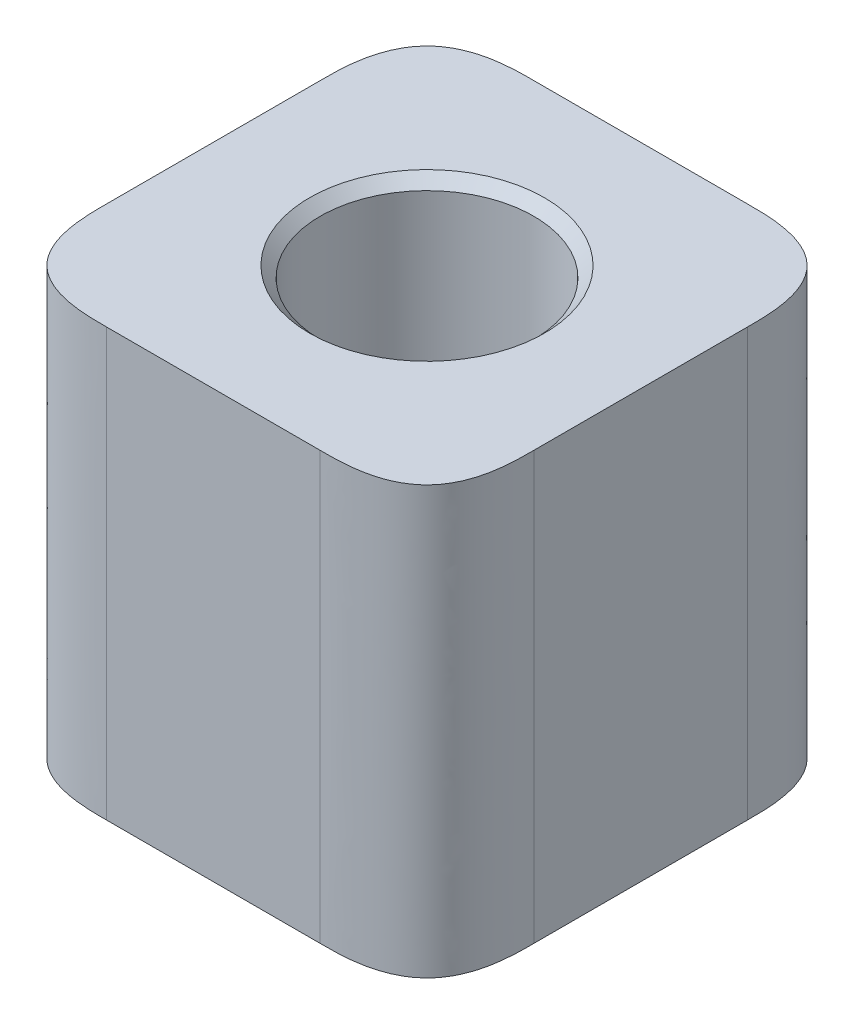
ISO-10303-21;
HEADER;
FILE_DESCRIPTION(('STEP AP214'),'2;1');
FILE_NAME('part.step','',(''),(''),'','','');
FILE_SCHEMA(('AUTOMOTIVE_DESIGN { 1 0 10303 214 1 1 1 1 }'));
ENDSEC;
DATA;
#1=APPLICATION_CONTEXT('core data for automotive mechanical design processes');
#2=APPLICATION_PROTOCOL_DEFINITION('international standard','automotive_design',2000,#1);
#3=PRODUCT_CONTEXT('',#1,'mechanical');
#4=PRODUCT('Part','Part','',(#3));
#5=PRODUCT_RELATED_PRODUCT_CATEGORY('part','',(#4));
#6=PRODUCT_DEFINITION_FORMATION('','',#4);
#7=PRODUCT_DEFINITION_CONTEXT('part definition',#1,'design');
#8=PRODUCT_DEFINITION('design','',#6,#7);
#9=PRODUCT_DEFINITION_SHAPE('','',#8);
#10=(LENGTH_UNIT() NAMED_UNIT(*) SI_UNIT(.MILLI.,.METRE.));
#11=(NAMED_UNIT(*) PLANE_ANGLE_UNIT() SI_UNIT($,.RADIAN.));
#12=(NAMED_UNIT(*) SI_UNIT($,.STERADIAN.) SOLID_ANGLE_UNIT());
#13=UNCERTAINTY_MEASURE_WITH_UNIT(LENGTH_MEASURE(1.E-05),#10,'distance_accuracy_value','');
#14=(GEOMETRIC_REPRESENTATION_CONTEXT(3) GLOBAL_UNCERTAINTY_ASSIGNED_CONTEXT((#13)) GLOBAL_UNIT_ASSIGNED_CONTEXT((#10,
#11,#12)) REPRESENTATION_CONTEXT('',''));
#15=CARTESIAN_POINT('',(0.,0.,0.));
#16=DIRECTION('',(0.,0.,1.));
#17=DIRECTION('',(1.,0.,0.));
#18=AXIS2_PLACEMENT_3D('',#15,#16,#17);
#19=CARTESIAN_POINT('',(0.,7.,0.));
#20=DIRECTION('',(0.,-1.,0.));
#21=DIRECTION('',(0.,0.,-1.));
#22=AXIS2_PLACEMENT_3D('',#19,#20,#21);
#23=CYLINDRICAL_SURFACE('',#22,2.);
#24=CARTESIAN_POINT('',(0.,6.8,0.));
#25=DIRECTION('',(0.,1.,0.));
#26=DIRECTION('',(0.,0.,1.));
#27=AXIS2_PLACEMENT_3D('',#24,#25,#26);
#28=CIRCLE('',#27,2.);
#29=CARTESIAN_POINT('',(0.,6.8,2.));
#30=VERTEX_POINT('',#29);
#31=EDGE_CURVE('E253',#30,#30,#28,.F.);
#32=ORIENTED_EDGE('',*,*,#31,.F.);
#33=EDGE_LOOP('',(#32));
#34=FACE_BOUND('',#33,.T.);
#35=CARTESIAN_POINT('',(0.,0.,0.));
#36=DIRECTION('',(0.,1.,0.));
#37=DIRECTION('',(0.,0.,1.));
#38=AXIS2_PLACEMENT_3D('',#35,#36,#37);
#39=CIRCLE('',#38,2.);
#40=CARTESIAN_POINT('',(0.,0.,2.));
#41=VERTEX_POINT('',#40);
#42=EDGE_CURVE('E273',#41,#41,#39,.T.);
#43=ORIENTED_EDGE('',*,*,#42,.F.);
#44=EDGE_LOOP('',(#43));
#45=FACE_BOUND('',#44,.T.);
#46=ADVANCED_FACE('F39',(#34,#45),#23,.F.);
#47=CARTESIAN_POINT('',(0.,0.,0.));
#48=DIRECTION('',(0.,-1.,0.));
#49=DIRECTION('',(0.,0.,-1.));
#50=AXIS2_PLACEMENT_3D('',#47,#48,#49);
#51=PLANE('',#50);
#52=ORIENTED_EDGE('',*,*,#42,.T.);
#53=EDGE_LOOP('',(#52));
#54=FACE_BOUND('',#53,.T.);
#55=ADVANCED_FACE('F461',(#54),#51,.F.);
#56=CARTESIAN_POINT('',(0.,7.,0.));
#57=DIRECTION('',(0.,1.,0.));
#58=DIRECTION('',(0.,0.,1.));
#59=AXIS2_PLACEMENT_3D('',#56,#57,#58);
#60=CONICAL_SURFACE('',#59,2.2,0.785398163397448);
#61=ORIENTED_EDGE('',*,*,#31,.T.);
#62=EDGE_LOOP('',(#61));
#63=FACE_BOUND('',#62,.T.);
#64=CARTESIAN_POINT('',(0.,7.,0.));
#65=DIRECTION('',(0.,1.,0.));
#66=DIRECTION('',(0.,0.,1.));
#67=AXIS2_PLACEMENT_3D('',#64,#65,#66);
#68=CIRCLE('',#67,2.2);
#69=CARTESIAN_POINT('',(0.,7.,2.2));
#70=VERTEX_POINT('',#69);
#71=EDGE_CURVE('E628',#70,#70,#68,.T.);
#72=ORIENTED_EDGE('',*,*,#71,.T.);
#73=EDGE_LOOP('',(#72));
#74=FACE_BOUND('',#73,.T.);
#75=ADVANCED_FACE('F458',(#63,#74),#60,.F.);
#76=CARTESIAN_POINT('',(0.,-1.,0.));
#77=DIRECTION('',(0.,-1.,0.));
#78=DIRECTION('',(0.,0.,-1.));
#79=AXIS2_PLACEMENT_3D('',#76,#77,#78);
#80=PLANE('',#79);
#81=DIRECTION('',(0.,0.,1.));
#82=VECTOR('',#81,1.);
#83=CARTESIAN_POINT('',(4.,-1.,4.));
#84=LINE('',#83,#82);
#85=CARTESIAN_POINT('',(4.,-1.,-2.));
#86=VERTEX_POINT('',#85);
#87=CARTESIAN_POINT('',(4.,-1.,2.));
#88=VERTEX_POINT('',#87);
#89=EDGE_CURVE('E117',#86,#88,#84,.T.);
#90=ORIENTED_EDGE('',*,*,#89,.T.);
#91=CARTESIAN_POINT('',(2.,-1.00000000000002,4.));
#92=CARTESIAN_POINT('',(2.33639610306789,-1.00000000000002,4.));
#93=CARTESIAN_POINT('',(2.67279220613578,-1.00000000000002,4.));
#94=CARTESIAN_POINT('',(3.4142135623731,-0.999999999999968,3.85661616032783));
#95=CARTESIAN_POINT('',(3.85661616032783,-0.999999999999968,3.4142135623731));
#96=CARTESIAN_POINT('',(4.,-1.00000000000002,2.67279220613578));
#97=CARTESIAN_POINT('',(4.,-1.00000000000002,2.33639610306789));
#98=CARTESIAN_POINT('',(4.,-1.00000000000002,2.));
#99=B_SPLINE_CURVE_WITH_KNOTS('',5,(#91,#92,#93,#94,#95,#96,#97,#98),.UNSPECIFIED.,.F.,.F.,(6,2,
6),(0.,0.5,1.),.UNSPECIFIED.);
#100=CARTESIAN_POINT('',(2.,-1.,4.));
#101=VERTEX_POINT('',#100);
#102=EDGE_CURVE('E238',#88,#101,#99,.F.);
#103=ORIENTED_EDGE('',*,*,#102,.T.);
#104=DIRECTION('',(-1.,0.,0.));
#105=VECTOR('',#104,1.);
#106=CARTESIAN_POINT('',(-4.,-1.,4.));
#107=LINE('',#106,#105);
#108=CARTESIAN_POINT('',(-2.,-1.,4.));
#109=VERTEX_POINT('',#108);
#110=EDGE_CURVE('E138',#101,#109,#107,.T.);
#111=ORIENTED_EDGE('',*,*,#110,.T.);
#112=CARTESIAN_POINT('',(-4.,-1.00000000000002,2.));
#113=CARTESIAN_POINT('',(-4.,-1.00000000000002,2.33639610306789));
#114=CARTESIAN_POINT('',(-4.,-1.00000000000002,2.67279220613578));
#115=CARTESIAN_POINT('',(-3.85661616032783,-0.999999999999968,3.4142135623731));
#116=CARTESIAN_POINT('',(-3.4142135623731,-0.999999999999968,3.85661616032783));
#117=CARTESIAN_POINT('',(-2.67279220613578,-1.00000000000002,4.));
#118=CARTESIAN_POINT('',(-2.33639610306789,-1.00000000000002,4.));
#119=CARTESIAN_POINT('',(-2.,-1.00000000000002,4.));
#120=B_SPLINE_CURVE_WITH_KNOTS('',5,(#112,#113,#114,#115,#116,#117,#118,#119),.UNSPECIFIED.,.F.,
.F.,(6,2,6),(0.,0.5,1.),.UNSPECIFIED.);
#121=CARTESIAN_POINT('',(-4.,-1.,2.));
#122=VERTEX_POINT('',#121);
#123=EDGE_CURVE('E242',#109,#122,#120,.F.);
#124=ORIENTED_EDGE('',*,*,#123,.T.);
#125=DIRECTION('',(0.,0.,-1.));
#126=VECTOR('',#125,1.);
#127=CARTESIAN_POINT('',(-4.,-1.,4.));
#128=LINE('',#127,#126);
#129=CARTESIAN_POINT('',(-4.,-1.,-2.));
#130=VERTEX_POINT('',#129);
#131=EDGE_CURVE('E247',#122,#130,#128,.T.);
#132=ORIENTED_EDGE('',*,*,#131,.T.);
#133=CARTESIAN_POINT('',(-2.,-1.00000000000002,-4.));
#134=CARTESIAN_POINT('',(-2.33639610306789,-1.00000000000002,-4.));
#135=CARTESIAN_POINT('',(-2.67279220613578,-1.00000000000002,-4.));
#136=CARTESIAN_POINT('',(-3.4142135623731,-0.999999999999968,-3.85661616032783));
#137=CARTESIAN_POINT('',(-3.85661616032783,-0.999999999999968,-3.4142135623731));
#138=CARTESIAN_POINT('',(-4.,-1.00000000000002,-2.67279220613578));
#139=CARTESIAN_POINT('',(-4.,-1.00000000000002,-2.33639610306789));
#140=CARTESIAN_POINT('',(-4.,-1.00000000000002,-2.));
#141=B_SPLINE_CURVE_WITH_KNOTS('',5,(#133,#134,#135,#136,#137,#138,#139,#140),.UNSPECIFIED.,.F.,
.F.,(6,2,6),(0.,0.5,1.),.UNSPECIFIED.);
#142=CARTESIAN_POINT('',(-2.,-1.,-4.));
#143=VERTEX_POINT('',#142);
#144=EDGE_CURVE('E125',#130,#143,#141,.F.);
#145=ORIENTED_EDGE('',*,*,#144,.T.);
#146=DIRECTION('',(1.,0.,0.));
#147=VECTOR('',#146,1.);
#148=CARTESIAN_POINT('',(-4.,-1.,-4.));
#149=LINE('',#148,#147);
#150=CARTESIAN_POINT('',(2.,-1.,-4.));
#151=VERTEX_POINT('',#150);
#152=EDGE_CURVE('E119',#143,#151,#149,.T.);
#153=ORIENTED_EDGE('',*,*,#152,.T.);
#154=CARTESIAN_POINT('',(4.,-1.00000000000002,-2.));
#155=CARTESIAN_POINT('',(4.,-1.00000000000002,-2.33639610306789));
#156=CARTESIAN_POINT('',(4.,-1.00000000000002,-2.67279220613578));
#157=CARTESIAN_POINT('',(3.85661616032783,-0.999999999999968,-3.4142135623731));
#158=CARTESIAN_POINT('',(3.4142135623731,-0.999999999999968,-3.85661616032783));
#159=CARTESIAN_POINT('',(2.67279220613578,-1.00000000000002,-4.));
#160=CARTESIAN_POINT('',(2.33639610306789,-1.00000000000002,-4.));
#161=CARTESIAN_POINT('',(2.,-1.00000000000002,-4.));
#162=B_SPLINE_CURVE_WITH_KNOTS('',5,(#154,#155,#156,#157,#158,#159,#160,#161),.UNSPECIFIED.,.F.,
.F.,(6,2,6),(0.,0.5,1.),.UNSPECIFIED.);
#163=EDGE_CURVE('E113',#151,#86,#162,.F.);
#164=ORIENTED_EDGE('',*,*,#163,.T.);
#165=EDGE_LOOP('',(#90,#103,#111,#124,#132,#145,#153,#164));
#166=FACE_BOUND('',#165,.T.);
#167=ADVANCED_FACE('F116',(#166),#80,.T.);
#168=CARTESIAN_POINT('',(-2.,7.4,4.));
#169=CARTESIAN_POINT('',(-2.,4.46666666666635,4.));
#170=CARTESIAN_POINT('',(-2.,1.53333333333333,4.));
#171=CARTESIAN_POINT('',(-2.,-1.4,4.));
#172=CARTESIAN_POINT('',(-2.33639610306789,7.4,4.));
#173=CARTESIAN_POINT('',(-2.33639610306789,4.46666666666635,4.));
#174=CARTESIAN_POINT('',(-2.33639610306789,1.53333333333333,4.));
#175=CARTESIAN_POINT('',(-2.33639610306789,-1.4,4.));
#176=CARTESIAN_POINT('',(-2.67279220613578,7.4,4.));
#177=CARTESIAN_POINT('',(-2.67279220613578,4.46666666666635,4.));
#178=CARTESIAN_POINT('',(-2.67279220613578,1.53333333333333,4.));
#179=CARTESIAN_POINT('',(-2.67279220613578,-1.4,4.));
#180=CARTESIAN_POINT('',(-3.4142135623731,7.4,3.85661616032783));
#181=CARTESIAN_POINT('',(-3.41421356237309,4.46666666667525,3.85661616032783));
#182=CARTESIAN_POINT('',(-3.41421356237309,1.53333333333333,3.85661616032783));
#183=CARTESIAN_POINT('',(-3.4142135623731,-1.4,3.85661616032783));
#184=CARTESIAN_POINT('',(-3.85661616032783,7.4,3.4142135623731));
#185=CARTESIAN_POINT('',(-3.85661616032783,4.46666666667525,3.41421356237309));
#186=CARTESIAN_POINT('',(-3.85661616032783,1.53333333333333,3.41421356237309));
#187=CARTESIAN_POINT('',(-3.85661616032783,-1.4,3.4142135623731));
#188=CARTESIAN_POINT('',(-4.,7.4,2.67279220613578));
#189=CARTESIAN_POINT('',(-4.,4.46666666666635,2.67279220613578));
#190=CARTESIAN_POINT('',(-4.,1.53333333333333,2.67279220613578));
#191=CARTESIAN_POINT('',(-4.,-1.4,2.67279220613578));
#192=CARTESIAN_POINT('',(-4.,7.4,2.33639610306789));
#193=CARTESIAN_POINT('',(-4.,4.46666666666635,2.33639610306789));
#194=CARTESIAN_POINT('',(-4.,1.53333333333333,2.33639610306789));
#195=CARTESIAN_POINT('',(-4.,-1.4,2.33639610306789));
#196=CARTESIAN_POINT('',(-4.,7.4,2.));
#197=CARTESIAN_POINT('',(-4.,4.46666666666635,2.));
#198=CARTESIAN_POINT('',(-4.,1.53333333333333,2.));
#199=CARTESIAN_POINT('',(-4.,-1.4,2.));
#200=B_SPLINE_SURFACE_WITH_KNOTS('',5,3,((#168,#169,#170,#171),(#172,#173,#174,#175),(#176,#177,
#178,#179),(#180,#181,#182,#183),(#184,#185,#186,#187),(#188,#189,#190,#191),(#192,#193,#194,
#195),(#196,#197,#198,#199)),.UNSPECIFIED.,.F.,.F.,.F.,(6,2,6),(4,4),(0.,0.5,1.),(-0.0004,
0.0084),.UNSPECIFIED.);
#201=CARTESIAN_POINT('',(-2.,6.99999999999957,4.));
#202=CARTESIAN_POINT('',(-2.33639610306789,6.99999999999957,4.));
#203=CARTESIAN_POINT('',(-2.67279220613578,6.99999999999957,4.));
#204=CARTESIAN_POINT('',(-3.41421356237309,7.00000000000068,3.85661616032783));
#205=CARTESIAN_POINT('',(-3.85661616032783,7.00000000000068,3.41421356237309));
#206=CARTESIAN_POINT('',(-4.,6.99999999999957,2.67279220613578));
#207=CARTESIAN_POINT('',(-4.,6.99999999999957,2.33639610306789));
#208=CARTESIAN_POINT('',(-4.,6.99999999999957,2.));
#209=B_SPLINE_CURVE_WITH_KNOTS('',5,(#201,#202,#203,#204,#205,#206,#207,#208),.UNSPECIFIED.,.F.,
.F.,(6,2,6),(0.,0.5,1.),.UNSPECIFIED.);
#210=CARTESIAN_POINT('',(-4.,7.,2.));
#211=VERTEX_POINT('',#210);
#212=CARTESIAN_POINT('',(-2.,7.,4.));
#213=VERTEX_POINT('',#212);
#214=EDGE_CURVE('E225',#211,#213,#209,.F.);
#215=CARTESIAN_POINT('',(-4.,7.4,2.));
#216=CARTESIAN_POINT('',(-4.,4.46666666666635,2.));
#217=CARTESIAN_POINT('',(-4.,1.53333333333333,2.));
#218=CARTESIAN_POINT('',(-4.,-1.4,2.));
#219=B_SPLINE_CURVE_WITH_KNOTS('',3,(#215,#216,#217,#218),.UNSPECIFIED.,.F.,.F.,(4,4),(-0.0004,
0.0084),.UNSPECIFIED.);
#220=EDGE_CURVE('E60',#122,#211,#219,.F.);
#221=CARTESIAN_POINT('',(-2.,-1.4,4.));
#222=CARTESIAN_POINT('',(-2.,1.53333333333333,4.));
#223=CARTESIAN_POINT('',(-2.,4.46666666666635,4.));
#224=CARTESIAN_POINT('',(-2.,7.4,4.));
#225=B_SPLINE_CURVE_WITH_KNOTS('',3,(#221,#222,#223,#224),.UNSPECIFIED.,.F.,.F.,(4,4),
(-0.000399999999999999,0.0084),.UNSPECIFIED.);
#226=EDGE_CURVE('E230',#213,#109,#225,.F.);
#227=ORIENTED_EDGE('',*,*,#214,.F.);
#228=ORIENTED_EDGE('',*,*,#220,.F.);
#229=ORIENTED_EDGE('',*,*,#123,.F.);
#230=ORIENTED_EDGE('',*,*,#226,.F.);
#231=EDGE_LOOP('',(#227,#228,#229,#230));
#232=FACE_BOUND('',#231,.T.);
#233=ADVANCED_FACE('F193',(#232),#200,.T.);
#234=CARTESIAN_POINT('',(-4.,7.,4.));
#235=DIRECTION('',(1.,0.,0.));
#236=DIRECTION('',(0.,0.,-1.));
#237=AXIS2_PLACEMENT_3D('',#234,#235,#236);
#238=PLANE('',#237);
#239=ORIENTED_EDGE('',*,*,#131,.F.);
#240=ORIENTED_EDGE('',*,*,#220,.T.);
#241=DIRECTION('',(0.,0.,1.));
#242=VECTOR('',#241,1.);
#243=CARTESIAN_POINT('',(-4.,7.,4.));
#244=LINE('',#243,#242);
#245=CARTESIAN_POINT('',(-4.,7.,-2.));
#246=VERTEX_POINT('',#245);
#247=EDGE_CURVE('E282',#246,#211,#244,.T.);
#248=ORIENTED_EDGE('',*,*,#247,.F.);
#249=CARTESIAN_POINT('',(-4.,-1.4,-2.));
#250=CARTESIAN_POINT('',(-4.,1.53333333333333,-2.));
#251=CARTESIAN_POINT('',(-4.,4.46666666666635,-2.));
#252=CARTESIAN_POINT('',(-4.,7.4,-2.));
#253=B_SPLINE_CURVE_WITH_KNOTS('',3,(#249,#250,#251,#252),.UNSPECIFIED.,.F.,.F.,(4,4),
(-0.000399999999999999,0.0084),.UNSPECIFIED.);
#254=EDGE_CURVE('E224',#246,#130,#253,.F.);
#255=ORIENTED_EDGE('',*,*,#254,.T.);
#256=EDGE_LOOP('',(#239,#240,#248,#255));
#257=FACE_BOUND('',#256,.T.);
#258=ADVANCED_FACE('F191',(#257),#238,.F.);
#259=CARTESIAN_POINT('',(-4.,7.4,-2.));
#260=CARTESIAN_POINT('',(-4.,4.46666666666635,-2.));
#261=CARTESIAN_POINT('',(-4.,1.53333333333333,-2.));
#262=CARTESIAN_POINT('',(-4.,-1.4,-2.));
#263=CARTESIAN_POINT('',(-4.,7.4,-2.33639610306789));
#264=CARTESIAN_POINT('',(-4.,4.46666666666635,-2.33639610306789));
#265=CARTESIAN_POINT('',(-4.,1.53333333333333,-2.33639610306789));
#266=CARTESIAN_POINT('',(-4.,-1.4,-2.33639610306789));
#267=CARTESIAN_POINT('',(-4.,7.4,-2.67279220613578));
#268=CARTESIAN_POINT('',(-4.,4.46666666666635,-2.67279220613578));
#269=CARTESIAN_POINT('',(-4.,1.53333333333333,-2.67279220613578));
#270=CARTESIAN_POINT('',(-4.,-1.4,-2.67279220613578));
#271=CARTESIAN_POINT('',(-3.85661616032783,7.4,-3.4142135623731));
#272=CARTESIAN_POINT('',(-3.85661616032783,4.46666666667525,-3.41421356237309));
#273=CARTESIAN_POINT('',(-3.85661616032783,1.53333333333333,-3.41421356237309));
#274=CARTESIAN_POINT('',(-3.85661616032783,-1.4,-3.4142135623731));
#275=CARTESIAN_POINT('',(-3.4142135623731,7.4,-3.85661616032783));
#276=CARTESIAN_POINT('',(-3.41421356237309,4.46666666667525,-3.85661616032783));
#277=CARTESIAN_POINT('',(-3.41421356237309,1.53333333333333,-3.85661616032783));
#278=CARTESIAN_POINT('',(-3.4142135623731,-1.4,-3.85661616032783));
#279=CARTESIAN_POINT('',(-2.67279220613578,7.4,-4.));
#280=CARTESIAN_POINT('',(-2.67279220613578,4.46666666666635,-4.));
#281=CARTESIAN_POINT('',(-2.67279220613578,1.53333333333333,-4.));
#282=CARTESIAN_POINT('',(-2.67279220613578,-1.4,-4.));
#283=CARTESIAN_POINT('',(-2.33639610306789,7.4,-4.));
#284=CARTESIAN_POINT('',(-2.33639610306789,4.46666666666635,-4.));
#285=CARTESIAN_POINT('',(-2.33639610306789,1.53333333333333,-4.));
#286=CARTESIAN_POINT('',(-2.33639610306789,-1.4,-4.));
#287=CARTESIAN_POINT('',(-2.,7.4,-4.));
#288=CARTESIAN_POINT('',(-2.,4.46666666666635,-4.));
#289=CARTESIAN_POINT('',(-2.,1.53333333333333,-4.));
#290=CARTESIAN_POINT('',(-2.,-1.4,-4.));
#291=B_SPLINE_SURFACE_WITH_KNOTS('',5,3,((#259,#260,#261,#262),(#263,#264,#265,#266),(#267,#268,
#269,#270),(#271,#272,#273,#274),(#275,#276,#277,#278),(#279,#280,#281,#282),(#283,#284,#285,
#286),(#287,#288,#289,#290)),.UNSPECIFIED.,.F.,.F.,.F.,(6,2,6),(4,4),(0.,0.5,1.),(-0.0004,
0.0084),.UNSPECIFIED.);
#292=CARTESIAN_POINT('',(-4.,6.99999999999957,-2.));
#293=CARTESIAN_POINT('',(-4.,6.99999999999957,-2.33639610306789));
#294=CARTESIAN_POINT('',(-4.,6.99999999999957,-2.67279220613578));
#295=CARTESIAN_POINT('',(-3.85661616032783,7.00000000000068,-3.41421356237309));
#296=CARTESIAN_POINT('',(-3.41421356237309,7.00000000000068,-3.85661616032783));
#297=CARTESIAN_POINT('',(-2.67279220613578,6.99999999999957,-4.));
#298=CARTESIAN_POINT('',(-2.33639610306789,6.99999999999957,-4.));
#299=CARTESIAN_POINT('',(-2.,6.99999999999957,-4.));
#300=B_SPLINE_CURVE_WITH_KNOTS('',5,(#292,#293,#294,#295,#296,#297,#298,#299),.UNSPECIFIED.,.F.,
.F.,(6,2,6),(0.,0.5,1.),.UNSPECIFIED.);
#301=CARTESIAN_POINT('',(-2.,7.,-4.));
#302=VERTEX_POINT('',#301);
#303=EDGE_CURVE('E68',#302,#246,#300,.F.);
#304=CARTESIAN_POINT('',(-2.,7.4,-4.));
#305=CARTESIAN_POINT('',(-2.,4.46666666666635,-4.));
#306=CARTESIAN_POINT('',(-2.,1.53333333333333,-4.));
#307=CARTESIAN_POINT('',(-2.,-1.4,-4.));
#308=B_SPLINE_CURVE_WITH_KNOTS('',3,(#304,#305,#306,#307),.UNSPECIFIED.,.F.,.F.,(4,4),(-0.0004,
0.0084),.UNSPECIFIED.);
#309=EDGE_CURVE('E11',#143,#302,#308,.F.);
#310=ORIENTED_EDGE('',*,*,#303,.F.);
#311=ORIENTED_EDGE('',*,*,#309,.F.);
#312=ORIENTED_EDGE('',*,*,#144,.F.);
#313=ORIENTED_EDGE('',*,*,#254,.F.);
#314=EDGE_LOOP('',(#310,#311,#312,#313));
#315=FACE_BOUND('',#314,.T.);
#316=ADVANCED_FACE('F176',(#315),#291,.T.);
#317=CARTESIAN_POINT('',(-4.,7.,-4.));
#318=DIRECTION('',(0.,0.,1.));
#319=DIRECTION('',(1.,0.,0.));
#320=AXIS2_PLACEMENT_3D('',#317,#318,#319);
#321=PLANE('',#320);
#322=ORIENTED_EDGE('',*,*,#152,.F.);
#323=ORIENTED_EDGE('',*,*,#309,.T.);
#324=DIRECTION('',(-1.,0.,0.));
#325=VECTOR('',#324,1.);
#326=CARTESIAN_POINT('',(-4.,7.,-4.));
#327=LINE('',#326,#325);
#328=CARTESIAN_POINT('',(2.,7.,-4.));
#329=VERTEX_POINT('',#328);
#330=EDGE_CURVE('E272',#329,#302,#327,.T.);
#331=ORIENTED_EDGE('',*,*,#330,.F.);
#332=CARTESIAN_POINT('',(2.,-1.4,-4.));
#333=CARTESIAN_POINT('',(2.,1.53333333333333,-4.));
#334=CARTESIAN_POINT('',(2.,4.46666666666635,-4.));
#335=CARTESIAN_POINT('',(2.,7.4,-4.));
#336=B_SPLINE_CURVE_WITH_KNOTS('',3,(#332,#333,#334,#335),.UNSPECIFIED.,.F.,.F.,(4,4),
(-0.000399999999999999,0.0084),.UNSPECIFIED.);
#337=EDGE_CURVE('E53',#329,#151,#336,.F.);
#338=ORIENTED_EDGE('',*,*,#337,.T.);
#339=EDGE_LOOP('',(#322,#323,#331,#338));
#340=FACE_BOUND('',#339,.T.);
#341=ADVANCED_FACE('F190',(#340),#321,.F.);
#342=CARTESIAN_POINT('',(2.,7.4,-4.));
#343=CARTESIAN_POINT('',(2.,4.46666666666635,-4.));
#344=CARTESIAN_POINT('',(2.,1.53333333333333,-4.));
#345=CARTESIAN_POINT('',(2.,-1.4,-4.));
#346=CARTESIAN_POINT('',(2.33639610306789,7.4,-4.));
#347=CARTESIAN_POINT('',(2.33639610306789,4.46666666666635,-4.));
#348=CARTESIAN_POINT('',(2.33639610306789,1.53333333333333,-4.));
#349=CARTESIAN_POINT('',(2.33639610306789,-1.4,-4.));
#350=CARTESIAN_POINT('',(2.67279220613578,7.4,-4.));
#351=CARTESIAN_POINT('',(2.67279220613578,4.46666666666635,-4.));
#352=CARTESIAN_POINT('',(2.67279220613578,1.53333333333333,-4.));
#353=CARTESIAN_POINT('',(2.67279220613578,-1.4,-4.));
#354=CARTESIAN_POINT('',(3.4142135623731,7.4,-3.85661616032783));
#355=CARTESIAN_POINT('',(3.41421356237309,4.46666666667525,-3.85661616032783));
#356=CARTESIAN_POINT('',(3.41421356237309,1.53333333333333,-3.85661616032783));
#357=CARTESIAN_POINT('',(3.4142135623731,-1.4,-3.85661616032783));
#358=CARTESIAN_POINT('',(3.85661616032783,7.4,-3.4142135623731));
#359=CARTESIAN_POINT('',(3.85661616032783,4.46666666667525,-3.41421356237309));
#360=CARTESIAN_POINT('',(3.85661616032783,1.53333333333333,-3.41421356237309));
#361=CARTESIAN_POINT('',(3.85661616032783,-1.4,-3.4142135623731));
#362=CARTESIAN_POINT('',(4.,7.4,-2.67279220613578));
#363=CARTESIAN_POINT('',(4.,4.46666666666635,-2.67279220613578));
#364=CARTESIAN_POINT('',(4.,1.53333333333333,-2.67279220613578));
#365=CARTESIAN_POINT('',(4.,-1.4,-2.67279220613578));
#366=CARTESIAN_POINT('',(4.,7.4,-2.33639610306789));
#367=CARTESIAN_POINT('',(4.,4.46666666666635,-2.33639610306789));
#368=CARTESIAN_POINT('',(4.,1.53333333333333,-2.33639610306789));
#369=CARTESIAN_POINT('',(4.,-1.4,-2.33639610306789));
#370=CARTESIAN_POINT('',(4.,7.4,-2.));
#371=CARTESIAN_POINT('',(4.,4.46666666666635,-2.));
#372=CARTESIAN_POINT('',(4.,1.53333333333333,-2.));
#373=CARTESIAN_POINT('',(4.,-1.4,-2.));
#374=B_SPLINE_SURFACE_WITH_KNOTS('',5,3,((#342,#343,#344,#345),(#346,#347,#348,#349),(#350,#351,
#352,#353),(#354,#355,#356,#357),(#358,#359,#360,#361),(#362,#363,#364,#365),(#366,#367,#368,
#369),(#370,#371,#372,#373)),.UNSPECIFIED.,.F.,.F.,.F.,(6,2,6),(4,4),(0.,0.5,1.),(-0.0004,
0.0084),.UNSPECIFIED.);
#375=CARTESIAN_POINT('',(2.,6.99999999999957,-4.));
#376=CARTESIAN_POINT('',(2.33639610306789,6.99999999999957,-4.));
#377=CARTESIAN_POINT('',(2.67279220613578,6.99999999999957,-4.));
#378=CARTESIAN_POINT('',(3.41421356237309,7.00000000000068,-3.85661616032783));
#379=CARTESIAN_POINT('',(3.85661616032783,7.00000000000068,-3.41421356237309));
#380=CARTESIAN_POINT('',(4.,6.99999999999957,-2.67279220613578));
#381=CARTESIAN_POINT('',(4.,6.99999999999957,-2.33639610306789));
#382=CARTESIAN_POINT('',(4.,6.99999999999957,-2.));
#383=B_SPLINE_CURVE_WITH_KNOTS('',5,(#375,#376,#377,#378,#379,#380,#381,#382),.UNSPECIFIED.,.F.,
.F.,(6,2,6),(0.,0.5,1.),.UNSPECIFIED.);
#384=CARTESIAN_POINT('',(4.,7.,-2.));
#385=VERTEX_POINT('',#384);
#386=EDGE_CURVE('E141',#385,#329,#383,.F.);
#387=CARTESIAN_POINT('',(4.,7.4,-2.));
#388=CARTESIAN_POINT('',(4.,4.46666666666635,-2.));
#389=CARTESIAN_POINT('',(4.,1.53333333333333,-2.));
#390=CARTESIAN_POINT('',(4.,-1.4,-2.));
#391=B_SPLINE_CURVE_WITH_KNOTS('',3,(#387,#388,#389,#390),.UNSPECIFIED.,.F.,.F.,(4,4),(-0.0004,
0.0084),.UNSPECIFIED.);
#392=EDGE_CURVE('E133',#86,#385,#391,.F.);
#393=ORIENTED_EDGE('',*,*,#386,.F.);
#394=ORIENTED_EDGE('',*,*,#392,.F.);
#395=ORIENTED_EDGE('',*,*,#163,.F.);
#396=ORIENTED_EDGE('',*,*,#337,.F.);
#397=EDGE_LOOP('',(#393,#394,#395,#396));
#398=FACE_BOUND('',#397,.T.);
#399=ADVANCED_FACE('F42',(#398),#374,.T.);
#400=CARTESIAN_POINT('',(4.,7.,4.));
#401=DIRECTION('',(-1.,0.,0.));
#402=DIRECTION('',(0.,0.,1.));
#403=AXIS2_PLACEMENT_3D('',#400,#401,#402);
#404=PLANE('',#403);
#405=DIRECTION('',(0.,0.,-1.));
#406=VECTOR('',#405,1.);
#407=CARTESIAN_POINT('',(4.,7.,4.));
#408=LINE('',#407,#406);
#409=CARTESIAN_POINT('',(4.,7.,2.));
#410=VERTEX_POINT('',#409);
#411=EDGE_CURVE('E270',#410,#385,#408,.T.);
#412=ORIENTED_EDGE('',*,*,#411,.F.);
#413=CARTESIAN_POINT('',(4.,-1.4,2.));
#414=CARTESIAN_POINT('',(4.,1.53333333333333,2.));
#415=CARTESIAN_POINT('',(4.,4.46666666666635,2.));
#416=CARTESIAN_POINT('',(4.,7.4,2.));
#417=B_SPLINE_CURVE_WITH_KNOTS('',3,(#413,#414,#415,#416),.UNSPECIFIED.,.F.,.F.,(4,4),
(-0.000399999999999999,0.0084),.UNSPECIFIED.);
#418=EDGE_CURVE('E126',#410,#88,#417,.F.);
#419=ORIENTED_EDGE('',*,*,#418,.T.);
#420=ORIENTED_EDGE('',*,*,#89,.F.);
#421=ORIENTED_EDGE('',*,*,#392,.T.);
#422=EDGE_LOOP('',(#412,#419,#420,#421));
#423=FACE_BOUND('',#422,.T.);
#424=ADVANCED_FACE('F132',(#423),#404,.F.);
#425=CARTESIAN_POINT('',(4.,7.4,2.));
#426=CARTESIAN_POINT('',(4.,4.46666666666635,2.));
#427=CARTESIAN_POINT('',(4.,1.53333333333333,2.));
#428=CARTESIAN_POINT('',(4.,-1.4,2.));
#429=CARTESIAN_POINT('',(4.,7.4,2.33639610306789));
#430=CARTESIAN_POINT('',(4.,4.46666666666635,2.33639610306789));
#431=CARTESIAN_POINT('',(4.,1.53333333333333,2.33639610306789));
#432=CARTESIAN_POINT('',(4.,-1.4,2.33639610306789));
#433=CARTESIAN_POINT('',(4.,7.4,2.67279220613578));
#434=CARTESIAN_POINT('',(4.,4.46666666666635,2.67279220613578));
#435=CARTESIAN_POINT('',(4.,1.53333333333333,2.67279220613578));
#436=CARTESIAN_POINT('',(4.,-1.4,2.67279220613578));
#437=CARTESIAN_POINT('',(3.85661616032783,7.4,3.4142135623731));
#438=CARTESIAN_POINT('',(3.85661616032783,4.46666666667525,3.41421356237309));
#439=CARTESIAN_POINT('',(3.85661616032783,1.53333333333333,3.41421356237309));
#440=CARTESIAN_POINT('',(3.85661616032783,-1.4,3.4142135623731));
#441=CARTESIAN_POINT('',(3.4142135623731,7.4,3.85661616032783));
#442=CARTESIAN_POINT('',(3.41421356237309,4.46666666667525,3.85661616032783));
#443=CARTESIAN_POINT('',(3.41421356237309,1.53333333333333,3.85661616032783));
#444=CARTESIAN_POINT('',(3.4142135623731,-1.4,3.85661616032783));
#445=CARTESIAN_POINT('',(2.67279220613578,7.4,4.));
#446=CARTESIAN_POINT('',(2.67279220613578,4.46666666666635,4.));
#447=CARTESIAN_POINT('',(2.67279220613578,1.53333333333333,4.));
#448=CARTESIAN_POINT('',(2.67279220613578,-1.4,4.));
#449=CARTESIAN_POINT('',(2.33639610306789,7.4,4.));
#450=CARTESIAN_POINT('',(2.33639610306789,4.46666666666635,4.));
#451=CARTESIAN_POINT('',(2.33639610306789,1.53333333333333,4.));
#452=CARTESIAN_POINT('',(2.33639610306789,-1.4,4.));
#453=CARTESIAN_POINT('',(2.,7.4,4.));
#454=CARTESIAN_POINT('',(2.,4.46666666666635,4.));
#455=CARTESIAN_POINT('',(2.,1.53333333333333,4.));
#456=CARTESIAN_POINT('',(2.,-1.4,4.));
#457=B_SPLINE_SURFACE_WITH_KNOTS('',5,3,((#425,#426,#427,#428),(#429,#430,#431,#432),(#433,#434,
#435,#436),(#437,#438,#439,#440),(#441,#442,#443,#444),(#445,#446,#447,#448),(#449,#450,#451,
#452),(#453,#454,#455,#456)),.UNSPECIFIED.,.F.,.F.,.F.,(6,2,6),(4,4),(0.,0.5,1.),(-0.0004,
0.0084),.UNSPECIFIED.);
#458=CARTESIAN_POINT('',(4.,6.99999999999957,2.));
#459=CARTESIAN_POINT('',(4.,6.99999999999957,2.33639610306789));
#460=CARTESIAN_POINT('',(4.,6.99999999999957,2.67279220613578));
#461=CARTESIAN_POINT('',(3.85661616032783,7.00000000000068,3.41421356237309));
#462=CARTESIAN_POINT('',(3.41421356237309,7.00000000000068,3.85661616032783));
#463=CARTESIAN_POINT('',(2.67279220613578,6.99999999999957,4.));
#464=CARTESIAN_POINT('',(2.33639610306789,6.99999999999957,4.));
#465=CARTESIAN_POINT('',(2.,6.99999999999957,4.));
#466=B_SPLINE_CURVE_WITH_KNOTS('',5,(#458,#459,#460,#461,#462,#463,#464,#465),.UNSPECIFIED.,.F.,
.F.,(6,2,6),(0.,0.5,1.),.UNSPECIFIED.);
#467=CARTESIAN_POINT('',(2.,7.,4.));
#468=VERTEX_POINT('',#467);
#469=EDGE_CURVE('E226',#468,#410,#466,.F.);
#470=CARTESIAN_POINT('',(2.,7.4,4.));
#471=CARTESIAN_POINT('',(2.,4.46666666666635,4.));
#472=CARTESIAN_POINT('',(2.,1.53333333333333,4.));
#473=CARTESIAN_POINT('',(2.,-1.4,4.));
#474=B_SPLINE_CURVE_WITH_KNOTS('',3,(#470,#471,#472,#473),.UNSPECIFIED.,.F.,.F.,(4,4),(-0.0004,
0.0084),.UNSPECIFIED.);
#475=EDGE_CURVE('E227',#101,#468,#474,.F.);
#476=ORIENTED_EDGE('',*,*,#469,.F.);
#477=ORIENTED_EDGE('',*,*,#475,.F.);
#478=ORIENTED_EDGE('',*,*,#102,.F.);
#479=ORIENTED_EDGE('',*,*,#418,.F.);
#480=EDGE_LOOP('',(#476,#477,#478,#479));
#481=FACE_BOUND('',#480,.T.);
#482=ADVANCED_FACE('F375',(#481),#457,.T.);
#483=CARTESIAN_POINT('',(-4.,7.,4.));
#484=DIRECTION('',(0.,0.,-1.));
#485=DIRECTION('',(-1.,0.,0.));
#486=AXIS2_PLACEMENT_3D('',#483,#484,#485);
#487=PLANE('',#486);
#488=ORIENTED_EDGE('',*,*,#110,.F.);
#489=ORIENTED_EDGE('',*,*,#475,.T.);
#490=DIRECTION('',(1.,0.,0.));
#491=VECTOR('',#490,1.);
#492=CARTESIAN_POINT('',(-4.,7.,4.));
#493=LINE('',#492,#491);
#494=EDGE_CURVE('E143',#213,#468,#493,.T.);
#495=ORIENTED_EDGE('',*,*,#494,.F.);
#496=ORIENTED_EDGE('',*,*,#226,.T.);
#497=EDGE_LOOP('',(#488,#489,#495,#496));
#498=FACE_BOUND('',#497,.T.);
#499=ADVANCED_FACE('F300',(#498),#487,.F.);
#500=CARTESIAN_POINT('',(0.,7.,0.));
#501=DIRECTION('',(0.,-1.,0.));
#502=DIRECTION('',(0.,0.,-1.));
#503=AXIS2_PLACEMENT_3D('',#500,#501,#502);
#504=PLANE('',#503);
#505=ORIENTED_EDGE('',*,*,#494,.T.);
#506=ORIENTED_EDGE('',*,*,#469,.T.);
#507=ORIENTED_EDGE('',*,*,#411,.T.);
#508=ORIENTED_EDGE('',*,*,#386,.T.);
#509=ORIENTED_EDGE('',*,*,#330,.T.);
#510=ORIENTED_EDGE('',*,*,#303,.T.);
#511=ORIENTED_EDGE('',*,*,#247,.T.);
#512=ORIENTED_EDGE('',*,*,#214,.T.);
#513=EDGE_LOOP('',(#505,#506,#507,#508,#509,#510,#511,#512));
#514=FACE_BOUND('',#513,.T.);
#515=ORIENTED_EDGE('',*,*,#71,.F.);
#516=EDGE_LOOP('',(#515));
#517=FACE_BOUND('',#516,.T.);
#518=ADVANCED_FACE('F291',(#514,#517),#504,.F.);
#519=CLOSED_SHELL('',(#46,#55,#75,#167,#233,#258,#316,#341,#399,#424,#482,#499,#518));
#520=MANIFOLD_SOLID_BREP('B2',#519);
#521=ADVANCED_BREP_SHAPE_REPRESENTATION('',(#18,#520),#14);
#522=SHAPE_DEFINITION_REPRESENTATION(#9,#521);
ENDSEC;
END-ISO-10303-21;
